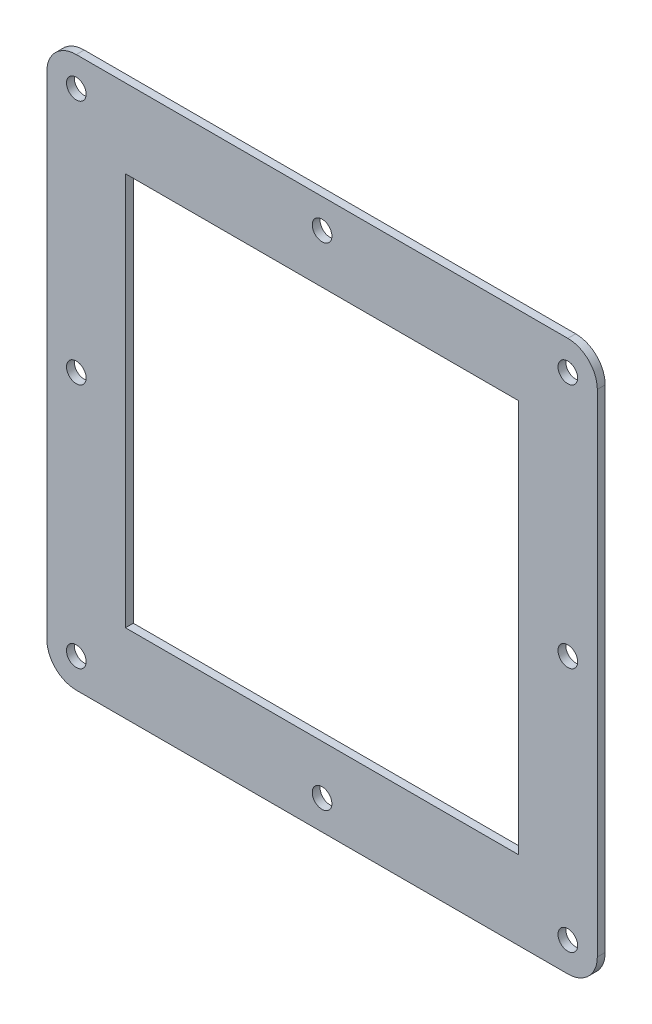
ISO-10303-21;
HEADER;
FILE_DESCRIPTION(('STEP AP214'),'2;1');
FILE_NAME('part.step','',(''),(''),'','','');
FILE_SCHEMA(('AUTOMOTIVE_DESIGN { 1 0 10303 214 1 1 1 1 }'));
ENDSEC;
DATA;
#1=APPLICATION_CONTEXT('core data for automotive mechanical design processes');
#2=APPLICATION_PROTOCOL_DEFINITION('international standard','automotive_design',2000,#1);
#3=PRODUCT_CONTEXT('',#1,'mechanical');
#4=PRODUCT('Part','Part','',(#3));
#5=PRODUCT_RELATED_PRODUCT_CATEGORY('part','',(#4));
#6=PRODUCT_DEFINITION_FORMATION('','',#4);
#7=PRODUCT_DEFINITION_CONTEXT('part definition',#1,'design');
#8=PRODUCT_DEFINITION('design','',#6,#7);
#9=PRODUCT_DEFINITION_SHAPE('','',#8);
#10=(LENGTH_UNIT() NAMED_UNIT(*) SI_UNIT(.MILLI.,.METRE.));
#11=(NAMED_UNIT(*) PLANE_ANGLE_UNIT() SI_UNIT($,.RADIAN.));
#12=(NAMED_UNIT(*) SI_UNIT($,.STERADIAN.) SOLID_ANGLE_UNIT());
#13=UNCERTAINTY_MEASURE_WITH_UNIT(LENGTH_MEASURE(1.E-05),#10,'distance_accuracy_value','');
#14=(GEOMETRIC_REPRESENTATION_CONTEXT(3) GLOBAL_UNCERTAINTY_ASSIGNED_CONTEXT((#13)) GLOBAL_UNIT_ASSIGNED_CONTEXT((#10,
#11,#12)) REPRESENTATION_CONTEXT('',''));
#15=CARTESIAN_POINT('',(0.,0.,0.));
#16=DIRECTION('',(0.,0.,1.));
#17=DIRECTION('',(1.,0.,0.));
#18=AXIS2_PLACEMENT_3D('',#15,#16,#17);
#19=CARTESIAN_POINT('',(-125.,-125.,4.));
#20=DIRECTION('',(0.,0.,1.));
#21=DIRECTION('',(1.,0.,0.));
#22=AXIS2_PLACEMENT_3D('',#19,#20,#21);
#23=PLANE('',#22);
#24=DIRECTION('',(0.,1.,0.));
#25=VECTOR('',#24,1.);
#26=CARTESIAN_POINT('',(100.,100.,4.));
#27=LINE('',#26,#25);
#28=CARTESIAN_POINT('',(100.,-100.,4.));
#29=VERTEX_POINT('',#28);
#30=CARTESIAN_POINT('',(100.,100.,4.));
#31=VERTEX_POINT('',#30);
#32=EDGE_CURVE('E48',#29,#31,#27,.T.);
#33=ORIENTED_EDGE('',*,*,#32,.F.);
#34=DIRECTION('',(1.,0.,0.));
#35=VECTOR('',#34,1.);
#36=CARTESIAN_POINT('',(-100.,-100.,4.));
#37=LINE('',#36,#35);
#38=CARTESIAN_POINT('',(-100.,-100.,4.));
#39=VERTEX_POINT('',#38);
#40=EDGE_CURVE('E140',#39,#29,#37,.T.);
#41=ORIENTED_EDGE('',*,*,#40,.F.);
#42=DIRECTION('',(0.,-1.,0.));
#43=VECTOR('',#42,1.);
#44=CARTESIAN_POINT('',(-100.,100.,4.));
#45=LINE('',#44,#43);
#46=CARTESIAN_POINT('',(-100.,100.,4.));
#47=VERTEX_POINT('',#46);
#48=EDGE_CURVE('E125',#47,#39,#45,.T.);
#49=ORIENTED_EDGE('',*,*,#48,.F.);
#50=DIRECTION('',(-1.,0.,0.));
#51=VECTOR('',#50,1.);
#52=CARTESIAN_POINT('',(-100.,100.,4.));
#53=LINE('',#52,#51);
#54=EDGE_CURVE('E134',#31,#47,#53,.T.);
#55=ORIENTED_EDGE('',*,*,#54,.F.);
#56=EDGE_LOOP('',(#33,#41,#49,#55));
#57=FACE_BOUND('',#56,.T.);
#58=CARTESIAN_POINT('',(0.,-125.,4.));
#59=DIRECTION('',(0.,0.,1.));
#60=DIRECTION('',(1.,0.,0.));
#61=AXIS2_PLACEMENT_3D('',#58,#59,#60);
#62=CIRCLE('',#61,5.);
#63=CARTESIAN_POINT('',(5.,-125.,4.));
#64=VERTEX_POINT('',#63);
#65=EDGE_CURVE('E156',#64,#64,#62,.T.);
#66=ORIENTED_EDGE('',*,*,#65,.F.);
#67=EDGE_LOOP('',(#66));
#68=FACE_BOUND('',#67,.T.);
#69=CARTESIAN_POINT('',(125.,0.,4.));
#70=DIRECTION('',(0.,0.,1.));
#71=DIRECTION('',(1.,0.,0.));
#72=AXIS2_PLACEMENT_3D('',#69,#70,#71);
#73=CIRCLE('',#72,5.00000000000001);
#74=CARTESIAN_POINT('',(130.,0.,4.));
#75=VERTEX_POINT('',#74);
#76=EDGE_CURVE('E174',#75,#75,#73,.T.);
#77=ORIENTED_EDGE('',*,*,#76,.F.);
#78=EDGE_LOOP('',(#77));
#79=FACE_BOUND('',#78,.T.);
#80=CARTESIAN_POINT('',(0.,125.,4.));
#81=DIRECTION('',(0.,0.,1.));
#82=DIRECTION('',(1.,0.,0.));
#83=AXIS2_PLACEMENT_3D('',#80,#81,#82);
#84=CIRCLE('',#83,5.);
#85=CARTESIAN_POINT('',(4.99999999999999,125.,4.));
#86=VERTEX_POINT('',#85);
#87=EDGE_CURVE('E186',#86,#86,#84,.T.);
#88=ORIENTED_EDGE('',*,*,#87,.F.);
#89=EDGE_LOOP('',(#88));
#90=FACE_BOUND('',#89,.T.);
#91=CARTESIAN_POINT('',(-125.,-125.,4.));
#92=DIRECTION('',(0.,0.,1.));
#93=DIRECTION('',(1.,0.,0.));
#94=AXIS2_PLACEMENT_3D('',#91,#92,#93);
#95=CIRCLE('',#94,15.);
#96=CARTESIAN_POINT('',(-140.,-125.,4.));
#97=VERTEX_POINT('',#96);
#98=CARTESIAN_POINT('',(-125.,-140.,4.));
#99=VERTEX_POINT('',#98);
#100=EDGE_CURVE('E198',#97,#99,#95,.T.);
#101=ORIENTED_EDGE('',*,*,#100,.T.);
#102=DIRECTION('',(1.,0.,0.));
#103=VECTOR('',#102,1.);
#104=CARTESIAN_POINT('',(-125.,-140.,4.));
#105=LINE('',#104,#103);
#106=CARTESIAN_POINT('',(125.,-140.,4.));
#107=VERTEX_POINT('',#106);
#108=EDGE_CURVE('E201',#99,#107,#105,.T.);
#109=ORIENTED_EDGE('',*,*,#108,.T.);
#110=CARTESIAN_POINT('',(125.,-125.,4.));
#111=DIRECTION('',(0.,0.,1.));
#112=DIRECTION('',(1.,0.,0.));
#113=AXIS2_PLACEMENT_3D('',#110,#111,#112);
#114=CIRCLE('',#113,15.);
#115=CARTESIAN_POINT('',(140.,-125.,4.));
#116=VERTEX_POINT('',#115);
#117=EDGE_CURVE('E204',#107,#116,#114,.T.);
#118=ORIENTED_EDGE('',*,*,#117,.T.);
#119=DIRECTION('',(0.,1.,0.));
#120=VECTOR('',#119,1.);
#121=CARTESIAN_POINT('',(140.,125.,4.));
#122=LINE('',#121,#120);
#123=CARTESIAN_POINT('',(140.,125.,4.));
#124=VERTEX_POINT('',#123);
#125=EDGE_CURVE('E206',#116,#124,#122,.T.);
#126=ORIENTED_EDGE('',*,*,#125,.T.);
#127=CARTESIAN_POINT('',(125.,125.,4.));
#128=DIRECTION('',(0.,0.,1.));
#129=DIRECTION('',(-1.,0.,0.));
#130=AXIS2_PLACEMENT_3D('',#127,#128,#129);
#131=CIRCLE('',#130,15.);
#132=CARTESIAN_POINT('',(125.,140.,4.));
#133=VERTEX_POINT('',#132);
#134=EDGE_CURVE('E208',#124,#133,#131,.T.);
#135=ORIENTED_EDGE('',*,*,#134,.T.);
#136=DIRECTION('',(-1.,0.,0.));
#137=VECTOR('',#136,1.);
#138=CARTESIAN_POINT('',(-125.,140.,4.));
#139=LINE('',#138,#137);
#140=CARTESIAN_POINT('',(-125.,140.,4.));
#141=VERTEX_POINT('',#140);
#142=EDGE_CURVE('E210',#133,#141,#139,.T.);
#143=ORIENTED_EDGE('',*,*,#142,.T.);
#144=CARTESIAN_POINT('',(-125.,125.,4.));
#145=DIRECTION('',(0.,0.,1.));
#146=DIRECTION('',(1.,0.,0.));
#147=AXIS2_PLACEMENT_3D('',#144,#145,#146);
#148=CIRCLE('',#147,15.);
#149=CARTESIAN_POINT('',(-140.,125.,4.));
#150=VERTEX_POINT('',#149);
#151=EDGE_CURVE('E212',#141,#150,#148,.T.);
#152=ORIENTED_EDGE('',*,*,#151,.T.);
#153=DIRECTION('',(0.,-1.,0.));
#154=VECTOR('',#153,1.);
#155=CARTESIAN_POINT('',(-140.,125.,4.));
#156=LINE('',#155,#154);
#157=EDGE_CURVE('E214',#150,#97,#156,.T.);
#158=ORIENTED_EDGE('',*,*,#157,.T.);
#159=EDGE_LOOP('',(#101,#109,#118,#126,#135,#143,#152,#158));
#160=FACE_BOUND('',#159,.T.);
#161=CARTESIAN_POINT('',(-125.,125.,4.));
#162=DIRECTION('',(0.,0.,1.));
#163=DIRECTION('',(1.,0.,0.));
#164=AXIS2_PLACEMENT_3D('',#161,#162,#163);
#165=CIRCLE('',#164,5.00000000000001);
#166=CARTESIAN_POINT('',(-120.,125.,4.));
#167=VERTEX_POINT('',#166);
#168=EDGE_CURVE('E192',#167,#167,#165,.T.);
#169=ORIENTED_EDGE('',*,*,#168,.F.);
#170=EDGE_LOOP('',(#169));
#171=FACE_BOUND('',#170,.T.);
#172=CARTESIAN_POINT('',(125.,125.,4.));
#173=DIRECTION('',(0.,0.,1.));
#174=DIRECTION('',(1.,0.,0.));
#175=AXIS2_PLACEMENT_3D('',#172,#173,#174);
#176=CIRCLE('',#175,4.99999999999999);
#177=CARTESIAN_POINT('',(130.,125.,4.));
#178=VERTEX_POINT('',#177);
#179=EDGE_CURVE('E180',#178,#178,#176,.T.);
#180=ORIENTED_EDGE('',*,*,#179,.F.);
#181=EDGE_LOOP('',(#180));
#182=FACE_BOUND('',#181,.T.);
#183=CARTESIAN_POINT('',(-125.,0.,4.));
#184=DIRECTION('',(0.,0.,1.));
#185=DIRECTION('',(1.,0.,0.));
#186=AXIS2_PLACEMENT_3D('',#183,#184,#185);
#187=CIRCLE('',#186,5.);
#188=CARTESIAN_POINT('',(-120.,0.,4.));
#189=VERTEX_POINT('',#188);
#190=EDGE_CURVE('E168',#189,#189,#187,.T.);
#191=ORIENTED_EDGE('',*,*,#190,.F.);
#192=EDGE_LOOP('',(#191));
#193=FACE_BOUND('',#192,.T.);
#194=CARTESIAN_POINT('',(-125.,-125.,4.));
#195=DIRECTION('',(0.,0.,1.));
#196=DIRECTION('',(1.,0.,0.));
#197=AXIS2_PLACEMENT_3D('',#194,#195,#196);
#198=CIRCLE('',#197,5.00000000000001);
#199=CARTESIAN_POINT('',(-120.,-125.,4.));
#200=VERTEX_POINT('',#199);
#201=EDGE_CURVE('E162',#200,#200,#198,.T.);
#202=ORIENTED_EDGE('',*,*,#201,.F.);
#203=EDGE_LOOP('',(#202));
#204=FACE_BOUND('',#203,.T.);
#205=CARTESIAN_POINT('',(125.,-125.,4.));
#206=DIRECTION('',(0.,0.,1.));
#207=DIRECTION('',(1.,0.,0.));
#208=AXIS2_PLACEMENT_3D('',#205,#206,#207);
#209=CIRCLE('',#208,5.00000000000002);
#210=CARTESIAN_POINT('',(130.,-125.,4.));
#211=VERTEX_POINT('',#210);
#212=EDGE_CURVE('E150',#211,#211,#209,.T.);
#213=ORIENTED_EDGE('',*,*,#212,.F.);
#214=EDGE_LOOP('',(#213));
#215=FACE_BOUND('',#214,.T.);
#216=ADVANCED_FACE('F33',(#57,#68,#79,#90,#160,#171,#182,#193,#204,#215),#23,.T.);
#217=CARTESIAN_POINT('',(-125.,-125.,0.));
#218=DIRECTION('',(0.,0.,1.));
#219=DIRECTION('',(1.,0.,0.));
#220=AXIS2_PLACEMENT_3D('',#217,#218,#219);
#221=PLANE('',#220);
#222=DIRECTION('',(1.,0.,0.));
#223=VECTOR('',#222,1.);
#224=CARTESIAN_POINT('',(-125.,-100.,0.));
#225=LINE('',#224,#223);
#226=CARTESIAN_POINT('',(-100.,-100.,0.));
#227=VERTEX_POINT('',#226);
#228=CARTESIAN_POINT('',(100.,-100.,0.));
#229=VERTEX_POINT('',#228);
#230=EDGE_CURVE('E41',#227,#229,#225,.T.);
#231=ORIENTED_EDGE('',*,*,#230,.T.);
#232=DIRECTION('',(0.,1.,0.));
#233=VECTOR('',#232,1.);
#234=CARTESIAN_POINT('',(100.,-125.,0.));
#235=LINE('',#234,#233);
#236=CARTESIAN_POINT('',(100.,100.,0.));
#237=VERTEX_POINT('',#236);
#238=EDGE_CURVE('E11',#229,#237,#235,.T.);
#239=ORIENTED_EDGE('',*,*,#238,.T.);
#240=DIRECTION('',(-1.,0.,0.));
#241=VECTOR('',#240,1.);
#242=CARTESIAN_POINT('',(-125.,100.,0.));
#243=LINE('',#242,#241);
#244=CARTESIAN_POINT('',(-100.,100.,0.));
#245=VERTEX_POINT('',#244);
#246=EDGE_CURVE('E255',#237,#245,#243,.T.);
#247=ORIENTED_EDGE('',*,*,#246,.T.);
#248=DIRECTION('',(0.,-1.,0.));
#249=VECTOR('',#248,1.);
#250=CARTESIAN_POINT('',(-100.,-125.,0.));
#251=LINE('',#250,#249);
#252=EDGE_CURVE('E128',#245,#227,#251,.T.);
#253=ORIENTED_EDGE('',*,*,#252,.T.);
#254=EDGE_LOOP('',(#231,#239,#247,#253));
#255=FACE_BOUND('',#254,.T.);
#256=CARTESIAN_POINT('',(-125.,-125.,0.));
#257=DIRECTION('',(0.,0.,1.));
#258=DIRECTION('',(1.,0.,0.));
#259=AXIS2_PLACEMENT_3D('',#256,#257,#258);
#260=CIRCLE('',#259,15.);
#261=CARTESIAN_POINT('',(-140.,-125.,0.));
#262=VERTEX_POINT('',#261);
#263=CARTESIAN_POINT('',(-125.,-140.,0.));
#264=VERTEX_POINT('',#263);
#265=EDGE_CURVE('E195',#262,#264,#260,.T.);
#266=ORIENTED_EDGE('',*,*,#265,.F.);
#267=DIRECTION('',(0.,-1.,0.));
#268=VECTOR('',#267,1.);
#269=CARTESIAN_POINT('',(-140.,125.,0.));
#270=LINE('',#269,#268);
#271=CARTESIAN_POINT('',(-140.,125.,0.));
#272=VERTEX_POINT('',#271);
#273=EDGE_CURVE('E202',#272,#262,#270,.T.);
#274=ORIENTED_EDGE('',*,*,#273,.F.);
#275=CARTESIAN_POINT('',(-125.,125.,0.));
#276=DIRECTION('',(0.,0.,1.));
#277=DIRECTION('',(1.,0.,0.));
#278=AXIS2_PLACEMENT_3D('',#275,#276,#277);
#279=CIRCLE('',#278,15.);
#280=CARTESIAN_POINT('',(-125.,140.,0.));
#281=VERTEX_POINT('',#280);
#282=EDGE_CURVE('E229',#281,#272,#279,.T.);
#283=ORIENTED_EDGE('',*,*,#282,.F.);
#284=DIRECTION('',(-1.,0.,0.));
#285=VECTOR('',#284,1.);
#286=CARTESIAN_POINT('',(-125.,140.,0.));
#287=LINE('',#286,#285);
#288=CARTESIAN_POINT('',(125.,140.,0.));
#289=VERTEX_POINT('',#288);
#290=EDGE_CURVE('E227',#289,#281,#287,.T.);
#291=ORIENTED_EDGE('',*,*,#290,.F.);
#292=CARTESIAN_POINT('',(125.,125.,0.));
#293=DIRECTION('',(0.,0.,1.));
#294=DIRECTION('',(-1.,0.,0.));
#295=AXIS2_PLACEMENT_3D('',#292,#293,#294);
#296=CIRCLE('',#295,15.);
#297=CARTESIAN_POINT('',(140.,125.,0.));
#298=VERTEX_POINT('',#297);
#299=EDGE_CURVE('E225',#298,#289,#296,.T.);
#300=ORIENTED_EDGE('',*,*,#299,.F.);
#301=DIRECTION('',(0.,1.,0.));
#302=VECTOR('',#301,1.);
#303=CARTESIAN_POINT('',(140.,125.,0.));
#304=LINE('',#303,#302);
#305=CARTESIAN_POINT('',(140.,-125.,0.));
#306=VERTEX_POINT('',#305);
#307=EDGE_CURVE('E223',#306,#298,#304,.T.);
#308=ORIENTED_EDGE('',*,*,#307,.F.);
#309=CARTESIAN_POINT('',(125.,-125.,0.));
#310=DIRECTION('',(0.,0.,1.));
#311=DIRECTION('',(1.,0.,0.));
#312=AXIS2_PLACEMENT_3D('',#309,#310,#311);
#313=CIRCLE('',#312,15.);
#314=CARTESIAN_POINT('',(125.,-140.,0.));
#315=VERTEX_POINT('',#314);
#316=EDGE_CURVE('E221',#315,#306,#313,.T.);
#317=ORIENTED_EDGE('',*,*,#316,.F.);
#318=DIRECTION('',(1.,0.,0.));
#319=VECTOR('',#318,1.);
#320=CARTESIAN_POINT('',(-125.,-140.,0.));
#321=LINE('',#320,#319);
#322=EDGE_CURVE('E219',#264,#315,#321,.T.);
#323=ORIENTED_EDGE('',*,*,#322,.F.);
#324=EDGE_LOOP('',(#266,#274,#283,#291,#300,#308,#317,#323));
#325=FACE_BOUND('',#324,.T.);
#326=CARTESIAN_POINT('',(-125.,125.,0.));
#327=DIRECTION('',(0.,0.,1.));
#328=DIRECTION('',(1.,0.,0.));
#329=AXIS2_PLACEMENT_3D('',#326,#327,#328);
#330=CIRCLE('',#329,5.00000000000001);
#331=CARTESIAN_POINT('',(-120.,125.,0.));
#332=VERTEX_POINT('',#331);
#333=EDGE_CURVE('E189',#332,#332,#330,.T.);
#334=ORIENTED_EDGE('',*,*,#333,.T.);
#335=EDGE_LOOP('',(#334));
#336=FACE_BOUND('',#335,.T.);
#337=CARTESIAN_POINT('',(0.,125.,0.));
#338=DIRECTION('',(0.,0.,1.));
#339=DIRECTION('',(1.,0.,0.));
#340=AXIS2_PLACEMENT_3D('',#337,#338,#339);
#341=CIRCLE('',#340,5.);
#342=CARTESIAN_POINT('',(4.99999999999999,125.,0.));
#343=VERTEX_POINT('',#342);
#344=EDGE_CURVE('E183',#343,#343,#341,.T.);
#345=ORIENTED_EDGE('',*,*,#344,.T.);
#346=EDGE_LOOP('',(#345));
#347=FACE_BOUND('',#346,.T.);
#348=CARTESIAN_POINT('',(125.,125.,0.));
#349=DIRECTION('',(0.,0.,1.));
#350=DIRECTION('',(1.,0.,0.));
#351=AXIS2_PLACEMENT_3D('',#348,#349,#350);
#352=CIRCLE('',#351,4.99999999999999);
#353=CARTESIAN_POINT('',(130.,125.,0.));
#354=VERTEX_POINT('',#353);
#355=EDGE_CURVE('E177',#354,#354,#352,.T.);
#356=ORIENTED_EDGE('',*,*,#355,.T.);
#357=EDGE_LOOP('',(#356));
#358=FACE_BOUND('',#357,.T.);
#359=CARTESIAN_POINT('',(125.,0.,0.));
#360=DIRECTION('',(0.,0.,1.));
#361=DIRECTION('',(1.,0.,0.));
#362=AXIS2_PLACEMENT_3D('',#359,#360,#361);
#363=CIRCLE('',#362,5.00000000000001);
#364=CARTESIAN_POINT('',(130.,0.,0.));
#365=VERTEX_POINT('',#364);
#366=EDGE_CURVE('E171',#365,#365,#363,.T.);
#367=ORIENTED_EDGE('',*,*,#366,.T.);
#368=EDGE_LOOP('',(#367));
#369=FACE_BOUND('',#368,.T.);
#370=CARTESIAN_POINT('',(-125.,0.,0.));
#371=DIRECTION('',(0.,0.,1.));
#372=DIRECTION('',(1.,0.,0.));
#373=AXIS2_PLACEMENT_3D('',#370,#371,#372);
#374=CIRCLE('',#373,5.);
#375=CARTESIAN_POINT('',(-120.,0.,0.));
#376=VERTEX_POINT('',#375);
#377=EDGE_CURVE('E165',#376,#376,#374,.T.);
#378=ORIENTED_EDGE('',*,*,#377,.T.);
#379=EDGE_LOOP('',(#378));
#380=FACE_BOUND('',#379,.T.);
#381=CARTESIAN_POINT('',(-125.,-125.,0.));
#382=DIRECTION('',(0.,0.,1.));
#383=DIRECTION('',(1.,0.,0.));
#384=AXIS2_PLACEMENT_3D('',#381,#382,#383);
#385=CIRCLE('',#384,5.00000000000001);
#386=CARTESIAN_POINT('',(-120.,-125.,0.));
#387=VERTEX_POINT('',#386);
#388=EDGE_CURVE('E159',#387,#387,#385,.T.);
#389=ORIENTED_EDGE('',*,*,#388,.T.);
#390=EDGE_LOOP('',(#389));
#391=FACE_BOUND('',#390,.T.);
#392=CARTESIAN_POINT('',(0.,-125.,0.));
#393=DIRECTION('',(0.,0.,1.));
#394=DIRECTION('',(1.,0.,0.));
#395=AXIS2_PLACEMENT_3D('',#392,#393,#394);
#396=CIRCLE('',#395,5.);
#397=CARTESIAN_POINT('',(5.,-125.,0.));
#398=VERTEX_POINT('',#397);
#399=EDGE_CURVE('E153',#398,#398,#396,.T.);
#400=ORIENTED_EDGE('',*,*,#399,.T.);
#401=EDGE_LOOP('',(#400));
#402=FACE_BOUND('',#401,.T.);
#403=CARTESIAN_POINT('',(125.,-125.,0.));
#404=DIRECTION('',(0.,0.,1.));
#405=DIRECTION('',(1.,0.,0.));
#406=AXIS2_PLACEMENT_3D('',#403,#404,#405);
#407=CIRCLE('',#406,5.00000000000002);
#408=CARTESIAN_POINT('',(130.,-125.,0.));
#409=VERTEX_POINT('',#408);
#410=EDGE_CURVE('E147',#409,#409,#407,.T.);
#411=ORIENTED_EDGE('',*,*,#410,.T.);
#412=EDGE_LOOP('',(#411));
#413=FACE_BOUND('',#412,.T.);
#414=ADVANCED_FACE('F259',(#255,#325,#336,#347,#358,#369,#380,#391,#402,#413),#221,.F.);
#415=CARTESIAN_POINT('',(-125.,-125.,4.));
#416=DIRECTION('',(0.,0.,-1.));
#417=DIRECTION('',(-1.,0.,0.));
#418=AXIS2_PLACEMENT_3D('',#415,#416,#417);
#419=CYLINDRICAL_SURFACE('',#418,15.);
#420=ORIENTED_EDGE('',*,*,#265,.T.);
#421=DIRECTION('',(0.,0.,-1.));
#422=VECTOR('',#421,1.);
#423=CARTESIAN_POINT('',(-125.,-140.,4.));
#424=LINE('',#423,#422);
#425=EDGE_CURVE('E252',#99,#264,#424,.T.);
#426=ORIENTED_EDGE('',*,*,#425,.F.);
#427=ORIENTED_EDGE('',*,*,#100,.F.);
#428=DIRECTION('',(0.,0.,-1.));
#429=VECTOR('',#428,1.);
#430=CARTESIAN_POINT('',(-140.,-125.,4.));
#431=LINE('',#430,#429);
#432=EDGE_CURVE('E216',#97,#262,#431,.T.);
#433=ORIENTED_EDGE('',*,*,#432,.T.);
#434=EDGE_LOOP('',(#420,#426,#427,#433));
#435=FACE_BOUND('',#434,.T.);
#436=ADVANCED_FACE('F35',(#435),#419,.T.);
#437=CARTESIAN_POINT('',(-125.,-140.,4.));
#438=DIRECTION('',(0.,1.,0.));
#439=DIRECTION('',(0.,0.,1.));
#440=AXIS2_PLACEMENT_3D('',#437,#438,#439);
#441=PLANE('',#440);
#442=ORIENTED_EDGE('',*,*,#322,.T.);
#443=DIRECTION('',(0.,0.,-1.));
#444=VECTOR('',#443,1.);
#445=CARTESIAN_POINT('',(125.,-140.,4.));
#446=LINE('',#445,#444);
#447=EDGE_CURVE('E249',#107,#315,#446,.T.);
#448=ORIENTED_EDGE('',*,*,#447,.F.);
#449=ORIENTED_EDGE('',*,*,#108,.F.);
#450=ORIENTED_EDGE('',*,*,#425,.T.);
#451=EDGE_LOOP('',(#442,#448,#449,#450));
#452=FACE_BOUND('',#451,.T.);
#453=ADVANCED_FACE('F309',(#452),#441,.F.);
#454=CARTESIAN_POINT('',(125.,-125.,4.));
#455=DIRECTION('',(0.,0.,-1.));
#456=DIRECTION('',(-1.,0.,0.));
#457=AXIS2_PLACEMENT_3D('',#454,#455,#456);
#458=CYLINDRICAL_SURFACE('',#457,15.);
#459=ORIENTED_EDGE('',*,*,#316,.T.);
#460=DIRECTION('',(0.,0.,-1.));
#461=VECTOR('',#460,1.);
#462=CARTESIAN_POINT('',(140.,-125.,4.));
#463=LINE('',#462,#461);
#464=EDGE_CURVE('E246',#116,#306,#463,.T.);
#465=ORIENTED_EDGE('',*,*,#464,.F.);
#466=ORIENTED_EDGE('',*,*,#117,.F.);
#467=ORIENTED_EDGE('',*,*,#447,.T.);
#468=EDGE_LOOP('',(#459,#465,#466,#467));
#469=FACE_BOUND('',#468,.T.);
#470=ADVANCED_FACE('F306',(#469),#458,.T.);
#471=CARTESIAN_POINT('',(140.,125.,4.));
#472=DIRECTION('',(-1.,0.,0.));
#473=DIRECTION('',(0.,0.,1.));
#474=AXIS2_PLACEMENT_3D('',#471,#472,#473);
#475=PLANE('',#474);
#476=ORIENTED_EDGE('',*,*,#307,.T.);
#477=DIRECTION('',(0.,0.,-1.));
#478=VECTOR('',#477,1.);
#479=CARTESIAN_POINT('',(140.,125.,4.));
#480=LINE('',#479,#478);
#481=EDGE_CURVE('E243',#124,#298,#480,.T.);
#482=ORIENTED_EDGE('',*,*,#481,.F.);
#483=ORIENTED_EDGE('',*,*,#125,.F.);
#484=ORIENTED_EDGE('',*,*,#464,.T.);
#485=EDGE_LOOP('',(#476,#482,#483,#484));
#486=FACE_BOUND('',#485,.T.);
#487=ADVANCED_FACE('F302',(#486),#475,.F.);
#488=CARTESIAN_POINT('',(125.,125.,4.));
#489=DIRECTION('',(0.,0.,-1.));
#490=DIRECTION('',(-1.,0.,0.));
#491=AXIS2_PLACEMENT_3D('',#488,#489,#490);
#492=CYLINDRICAL_SURFACE('',#491,15.);
#493=ORIENTED_EDGE('',*,*,#299,.T.);
#494=DIRECTION('',(0.,0.,-1.));
#495=VECTOR('',#494,1.);
#496=CARTESIAN_POINT('',(125.,140.,4.));
#497=LINE('',#496,#495);
#498=EDGE_CURVE('E240',#133,#289,#497,.T.);
#499=ORIENTED_EDGE('',*,*,#498,.F.);
#500=ORIENTED_EDGE('',*,*,#134,.F.);
#501=ORIENTED_EDGE('',*,*,#481,.T.);
#502=EDGE_LOOP('',(#493,#499,#500,#501));
#503=FACE_BOUND('',#502,.T.);
#504=ADVANCED_FACE('F298',(#503),#492,.T.);
#505=CARTESIAN_POINT('',(-125.,140.,4.));
#506=DIRECTION('',(0.,-1.,0.));
#507=DIRECTION('',(0.,0.,-1.));
#508=AXIS2_PLACEMENT_3D('',#505,#506,#507);
#509=PLANE('',#508);
#510=ORIENTED_EDGE('',*,*,#290,.T.);
#511=DIRECTION('',(0.,0.,-1.));
#512=VECTOR('',#511,1.);
#513=CARTESIAN_POINT('',(-125.,140.,4.));
#514=LINE('',#513,#512);
#515=EDGE_CURVE('E237',#141,#281,#514,.T.);
#516=ORIENTED_EDGE('',*,*,#515,.F.);
#517=ORIENTED_EDGE('',*,*,#142,.F.);
#518=ORIENTED_EDGE('',*,*,#498,.T.);
#519=EDGE_LOOP('',(#510,#516,#517,#518));
#520=FACE_BOUND('',#519,.T.);
#521=ADVANCED_FACE('F294',(#520),#509,.F.);
#522=CARTESIAN_POINT('',(-125.,125.,4.));
#523=DIRECTION('',(0.,0.,-1.));
#524=DIRECTION('',(-1.,0.,0.));
#525=AXIS2_PLACEMENT_3D('',#522,#523,#524);
#526=CYLINDRICAL_SURFACE('',#525,15.);
#527=ORIENTED_EDGE('',*,*,#282,.T.);
#528=DIRECTION('',(0.,0.,-1.));
#529=VECTOR('',#528,1.);
#530=CARTESIAN_POINT('',(-140.,125.,4.));
#531=LINE('',#530,#529);
#532=EDGE_CURVE('E234',#150,#272,#531,.T.);
#533=ORIENTED_EDGE('',*,*,#532,.F.);
#534=ORIENTED_EDGE('',*,*,#151,.F.);
#535=ORIENTED_EDGE('',*,*,#515,.T.);
#536=EDGE_LOOP('',(#527,#533,#534,#535));
#537=FACE_BOUND('',#536,.T.);
#538=ADVANCED_FACE('F290',(#537),#526,.T.);
#539=CARTESIAN_POINT('',(-140.,125.,4.));
#540=DIRECTION('',(1.,0.,0.));
#541=DIRECTION('',(0.,0.,-1.));
#542=AXIS2_PLACEMENT_3D('',#539,#540,#541);
#543=PLANE('',#542);
#544=ORIENTED_EDGE('',*,*,#273,.T.);
#545=ORIENTED_EDGE('',*,*,#432,.F.);
#546=ORIENTED_EDGE('',*,*,#157,.F.);
#547=ORIENTED_EDGE('',*,*,#532,.T.);
#548=EDGE_LOOP('',(#544,#545,#546,#547));
#549=FACE_BOUND('',#548,.T.);
#550=ADVANCED_FACE('F287',(#549),#543,.F.);
#551=CARTESIAN_POINT('',(-125.,125.,4.));
#552=DIRECTION('',(0.,0.,-1.));
#553=DIRECTION('',(-1.,0.,0.));
#554=AXIS2_PLACEMENT_3D('',#551,#552,#553);
#555=CYLINDRICAL_SURFACE('',#554,5.00000000000001);
#556=ORIENTED_EDGE('',*,*,#168,.T.);
#557=EDGE_LOOP('',(#556));
#558=FACE_BOUND('',#557,.T.);
#559=ORIENTED_EDGE('',*,*,#333,.F.);
#560=EDGE_LOOP('',(#559));
#561=FACE_BOUND('',#560,.T.);
#562=ADVANCED_FACE('F284',(#558,#561),#555,.F.);
#563=CARTESIAN_POINT('',(0.,125.,4.));
#564=DIRECTION('',(0.,0.,-1.));
#565=DIRECTION('',(-1.,0.,0.));
#566=AXIS2_PLACEMENT_3D('',#563,#564,#565);
#567=CYLINDRICAL_SURFACE('',#566,5.);
#568=ORIENTED_EDGE('',*,*,#87,.T.);
#569=EDGE_LOOP('',(#568));
#570=FACE_BOUND('',#569,.T.);
#571=ORIENTED_EDGE('',*,*,#344,.F.);
#572=EDGE_LOOP('',(#571));
#573=FACE_BOUND('',#572,.T.);
#574=ADVANCED_FACE('F380',(#570,#573),#567,.F.);
#575=CARTESIAN_POINT('',(125.,125.,4.));
#576=DIRECTION('',(0.,0.,-1.));
#577=DIRECTION('',(-1.,0.,0.));
#578=AXIS2_PLACEMENT_3D('',#575,#576,#577);
#579=CYLINDRICAL_SURFACE('',#578,4.99999999999999);
#580=ORIENTED_EDGE('',*,*,#179,.T.);
#581=EDGE_LOOP('',(#580));
#582=FACE_BOUND('',#581,.T.);
#583=ORIENTED_EDGE('',*,*,#355,.F.);
#584=EDGE_LOOP('',(#583));
#585=FACE_BOUND('',#584,.T.);
#586=ADVANCED_FACE('F377',(#582,#585),#579,.F.);
#587=CARTESIAN_POINT('',(125.,0.,4.));
#588=DIRECTION('',(0.,0.,-1.));
#589=DIRECTION('',(-1.,0.,0.));
#590=AXIS2_PLACEMENT_3D('',#587,#588,#589);
#591=CYLINDRICAL_SURFACE('',#590,5.00000000000001);
#592=ORIENTED_EDGE('',*,*,#76,.T.);
#593=EDGE_LOOP('',(#592));
#594=FACE_BOUND('',#593,.T.);
#595=ORIENTED_EDGE('',*,*,#366,.F.);
#596=EDGE_LOOP('',(#595));
#597=FACE_BOUND('',#596,.T.);
#598=ADVANCED_FACE('F373',(#594,#597),#591,.F.);
#599=CARTESIAN_POINT('',(-125.,0.,4.));
#600=DIRECTION('',(0.,0.,-1.));
#601=DIRECTION('',(-1.,0.,0.));
#602=AXIS2_PLACEMENT_3D('',#599,#600,#601);
#603=CYLINDRICAL_SURFACE('',#602,5.);
#604=ORIENTED_EDGE('',*,*,#190,.T.);
#605=EDGE_LOOP('',(#604));
#606=FACE_BOUND('',#605,.T.);
#607=ORIENTED_EDGE('',*,*,#377,.F.);
#608=EDGE_LOOP('',(#607));
#609=FACE_BOUND('',#608,.T.);
#610=ADVANCED_FACE('F358',(#606,#609),#603,.F.);
#611=CARTESIAN_POINT('',(-125.,-125.,4.));
#612=DIRECTION('',(0.,0.,-1.));
#613=DIRECTION('',(-1.,0.,0.));
#614=AXIS2_PLACEMENT_3D('',#611,#612,#613);
#615=CYLINDRICAL_SURFACE('',#614,5.00000000000001);
#616=ORIENTED_EDGE('',*,*,#201,.T.);
#617=EDGE_LOOP('',(#616));
#618=FACE_BOUND('',#617,.T.);
#619=ORIENTED_EDGE('',*,*,#388,.F.);
#620=EDGE_LOOP('',(#619));
#621=FACE_BOUND('',#620,.T.);
#622=ADVANCED_FACE('F355',(#618,#621),#615,.F.);
#623=CARTESIAN_POINT('',(0.,-125.,4.));
#624=DIRECTION('',(0.,0.,-1.));
#625=DIRECTION('',(-1.,0.,0.));
#626=AXIS2_PLACEMENT_3D('',#623,#624,#625);
#627=CYLINDRICAL_SURFACE('',#626,5.);
#628=ORIENTED_EDGE('',*,*,#65,.T.);
#629=EDGE_LOOP('',(#628));
#630=FACE_BOUND('',#629,.T.);
#631=ORIENTED_EDGE('',*,*,#399,.F.);
#632=EDGE_LOOP('',(#631));
#633=FACE_BOUND('',#632,.T.);
#634=ADVANCED_FACE('F273',(#630,#633),#627,.F.);
#635=CARTESIAN_POINT('',(125.,-125.,4.));
#636=DIRECTION('',(0.,0.,-1.));
#637=DIRECTION('',(-1.,0.,0.));
#638=AXIS2_PLACEMENT_3D('',#635,#636,#637);
#639=CYLINDRICAL_SURFACE('',#638,5.00000000000002);
#640=ORIENTED_EDGE('',*,*,#212,.T.);
#641=EDGE_LOOP('',(#640));
#642=FACE_BOUND('',#641,.T.);
#643=ORIENTED_EDGE('',*,*,#410,.F.);
#644=EDGE_LOOP('',(#643));
#645=FACE_BOUND('',#644,.T.);
#646=ADVANCED_FACE('F266',(#642,#645),#639,.F.);
#647=CARTESIAN_POINT('',(100.,100.,-6.));
#648=DIRECTION('',(1.,0.,0.));
#649=DIRECTION('',(0.,1.,0.));
#650=AXIS2_PLACEMENT_3D('',#647,#648,#649);
#651=PLANE('',#650);
#652=DIRECTION('',(0.,0.,1.));
#653=VECTOR('',#652,1.);
#654=CARTESIAN_POINT('',(100.,-100.,-6.));
#655=LINE('',#654,#653);
#656=EDGE_CURVE('E145',#229,#29,#655,.T.);
#657=ORIENTED_EDGE('',*,*,#656,.T.);
#658=ORIENTED_EDGE('',*,*,#32,.T.);
#659=DIRECTION('',(0.,0.,1.));
#660=VECTOR('',#659,1.);
#661=CARTESIAN_POINT('',(100.,100.,-6.));
#662=LINE('',#661,#660);
#663=EDGE_CURVE('E131',#237,#31,#662,.T.);
#664=ORIENTED_EDGE('',*,*,#663,.F.);
#665=ORIENTED_EDGE('',*,*,#238,.F.);
#666=EDGE_LOOP('',(#657,#658,#664,#665));
#667=FACE_BOUND('',#666,.T.);
#668=ADVANCED_FACE('F264',(#667),#651,.F.);
#669=CARTESIAN_POINT('',(-100.,-100.,-6.));
#670=DIRECTION('',(0.,-1.,0.));
#671=DIRECTION('',(0.,0.,-1.));
#672=AXIS2_PLACEMENT_3D('',#669,#670,#671);
#673=PLANE('',#672);
#674=DIRECTION('',(0.,0.,1.));
#675=VECTOR('',#674,1.);
#676=CARTESIAN_POINT('',(-100.,-100.,-6.));
#677=LINE('',#676,#675);
#678=EDGE_CURVE('E130',#227,#39,#677,.T.);
#679=ORIENTED_EDGE('',*,*,#678,.T.);
#680=ORIENTED_EDGE('',*,*,#40,.T.);
#681=ORIENTED_EDGE('',*,*,#656,.F.);
#682=ORIENTED_EDGE('',*,*,#230,.F.);
#683=EDGE_LOOP('',(#679,#680,#681,#682));
#684=FACE_BOUND('',#683,.T.);
#685=ADVANCED_FACE('F263',(#684),#673,.F.);
#686=CARTESIAN_POINT('',(-100.,100.,-6.));
#687=DIRECTION('',(-1.,0.,0.));
#688=DIRECTION('',(0.,-1.,0.));
#689=AXIS2_PLACEMENT_3D('',#686,#687,#688);
#690=PLANE('',#689);
#691=DIRECTION('',(0.,0.,1.));
#692=VECTOR('',#691,1.);
#693=CARTESIAN_POINT('',(-100.,100.,-6.));
#694=LINE('',#693,#692);
#695=EDGE_CURVE('E56',#245,#47,#694,.T.);
#696=ORIENTED_EDGE('',*,*,#695,.T.);
#697=ORIENTED_EDGE('',*,*,#48,.T.);
#698=ORIENTED_EDGE('',*,*,#678,.F.);
#699=ORIENTED_EDGE('',*,*,#252,.F.);
#700=EDGE_LOOP('',(#696,#697,#698,#699));
#701=FACE_BOUND('',#700,.T.);
#702=ADVANCED_FACE('F122',(#701),#690,.F.);
#703=CARTESIAN_POINT('',(-100.,100.,-6.));
#704=DIRECTION('',(0.,1.,0.));
#705=DIRECTION('',(0.,0.,1.));
#706=AXIS2_PLACEMENT_3D('',#703,#704,#705);
#707=PLANE('',#706);
#708=ORIENTED_EDGE('',*,*,#663,.T.);
#709=ORIENTED_EDGE('',*,*,#54,.T.);
#710=ORIENTED_EDGE('',*,*,#695,.F.);
#711=ORIENTED_EDGE('',*,*,#246,.F.);
#712=EDGE_LOOP('',(#708,#709,#710,#711));
#713=FACE_BOUND('',#712,.T.);
#714=ADVANCED_FACE('F135',(#713),#707,.F.);
#715=CLOSED_SHELL('',(#216,#414,#436,#453,#470,#487,#504,#521,#538,#550,#562,#574,#586,#598,
#610,#622,#634,#646,#668,#685,#702,#714));
#716=MANIFOLD_SOLID_BREP('B2',#715);
#717=ADVANCED_BREP_SHAPE_REPRESENTATION('',(#18,#716),#14);
#718=SHAPE_DEFINITION_REPRESENTATION(#9,#717);
ENDSEC;
END-ISO-10303-21;
